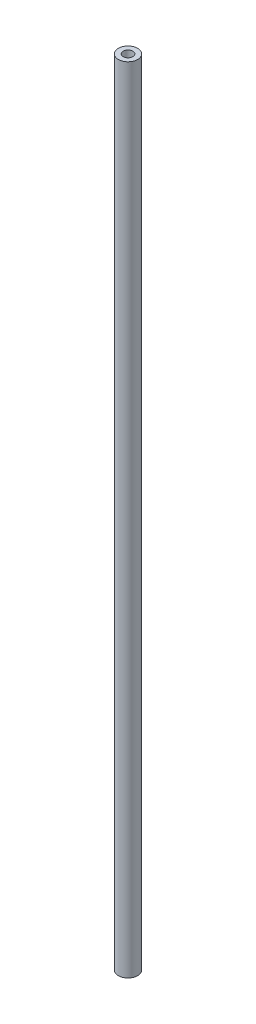
ISO-10303-21;
HEADER;
FILE_DESCRIPTION(('STEP AP214'),'2;1');
FILE_NAME('part.step','',(''),(''),'','','');
FILE_SCHEMA(('AUTOMOTIVE_DESIGN { 1 0 10303 214 1 1 1 1 }'));
ENDSEC;
DATA;
#1=APPLICATION_CONTEXT('core data for automotive mechanical design processes');
#2=APPLICATION_PROTOCOL_DEFINITION('international standard','automotive_design',2000,#1);
#3=PRODUCT_CONTEXT('',#1,'mechanical');
#4=PRODUCT('Part','Part','',(#3));
#5=PRODUCT_RELATED_PRODUCT_CATEGORY('part','',(#4));
#6=PRODUCT_DEFINITION_FORMATION('','',#4);
#7=PRODUCT_DEFINITION_CONTEXT('part definition',#1,'design');
#8=PRODUCT_DEFINITION('design','',#6,#7);
#9=PRODUCT_DEFINITION_SHAPE('','',#8);
#10=(LENGTH_UNIT() NAMED_UNIT(*) SI_UNIT(.MILLI.,.METRE.));
#11=(NAMED_UNIT(*) PLANE_ANGLE_UNIT() SI_UNIT($,.RADIAN.));
#12=(NAMED_UNIT(*) SI_UNIT($,.STERADIAN.) SOLID_ANGLE_UNIT());
#13=UNCERTAINTY_MEASURE_WITH_UNIT(LENGTH_MEASURE(1.E-05),#10,'distance_accuracy_value','');
#14=(GEOMETRIC_REPRESENTATION_CONTEXT(3) GLOBAL_UNCERTAINTY_ASSIGNED_CONTEXT((#13)) GLOBAL_UNIT_ASSIGNED_CONTEXT((#10,
#11,#12)) REPRESENTATION_CONTEXT('',''));
#15=CARTESIAN_POINT('',(0.,0.,0.));
#16=DIRECTION('',(0.,0.,1.));
#17=DIRECTION('',(1.,0.,0.));
#18=AXIS2_PLACEMENT_3D('',#15,#16,#17);
#19=CARTESIAN_POINT('',(0.,0.,0.));
#20=DIRECTION('',(0.,-1.,0.));
#21=DIRECTION('',(0.,0.,-1.));
#22=AXIS2_PLACEMENT_3D('',#19,#20,#21);
#23=CYLINDRICAL_SURFACE('',#22,1.);
#24=CARTESIAN_POINT('',(0.,164.,0.));
#25=DIRECTION('',(0.,-1.,0.));
#26=DIRECTION('',(0.,0.,-1.));
#27=AXIS2_PLACEMENT_3D('',#24,#25,#26);
#28=CIRCLE('',#27,1.);
#29=CARTESIAN_POINT('',(0.,164.,-1.));
#30=VERTEX_POINT('',#29);
#31=EDGE_CURVE('E10',#30,#30,#28,.T.);
#32=ORIENTED_EDGE('',*,*,#31,.F.);
#33=EDGE_LOOP('',(#32));
#34=FACE_BOUND('',#33,.T.);
#35=CARTESIAN_POINT('',(0.,0.,0.));
#36=DIRECTION('',(0.,-1.,0.));
#37=DIRECTION('',(0.,0.,-1.));
#38=AXIS2_PLACEMENT_3D('',#35,#36,#37);
#39=CIRCLE('',#38,1.);
#40=CARTESIAN_POINT('',(0.,0.,-1.));
#41=VERTEX_POINT('',#40);
#42=EDGE_CURVE('E44',#41,#41,#39,.T.);
#43=ORIENTED_EDGE('',*,*,#42,.T.);
#44=EDGE_LOOP('',(#43));
#45=FACE_BOUND('',#44,.T.);
#46=ADVANCED_FACE('F30',(#34,#45),#23,.F.);
#47=CARTESIAN_POINT('',(-1.,164.,0.));
#48=DIRECTION('',(0.,-1.,0.));
#49=DIRECTION('',(0.,0.,-1.));
#50=AXIS2_PLACEMENT_3D('',#47,#48,#49);
#51=PLANE('',#50);
#52=CARTESIAN_POINT('',(0.,164.,0.));
#53=DIRECTION('',(0.,-1.,0.));
#54=DIRECTION('',(0.,0.,-1.));
#55=AXIS2_PLACEMENT_3D('',#52,#53,#54);
#56=CIRCLE('',#55,2.);
#57=CARTESIAN_POINT('',(0.,164.,-2.));
#58=VERTEX_POINT('',#57);
#59=EDGE_CURVE('E36',#58,#58,#56,.T.);
#60=ORIENTED_EDGE('',*,*,#59,.F.);
#61=EDGE_LOOP('',(#60));
#62=FACE_BOUND('',#61,.T.);
#63=ORIENTED_EDGE('',*,*,#31,.T.);
#64=EDGE_LOOP('',(#63));
#65=FACE_BOUND('',#64,.T.);
#66=ADVANCED_FACE('F59',(#62,#65),#51,.F.);
#67=CARTESIAN_POINT('',(0.,0.,0.));
#68=DIRECTION('',(0.,-1.,0.));
#69=DIRECTION('',(0.,0.,-1.));
#70=AXIS2_PLACEMENT_3D('',#67,#68,#69);
#71=CYLINDRICAL_SURFACE('',#70,2.);
#72=CARTESIAN_POINT('',(0.,0.,0.));
#73=DIRECTION('',(0.,-1.,0.));
#74=DIRECTION('',(0.,0.,-1.));
#75=AXIS2_PLACEMENT_3D('',#72,#73,#74);
#76=CIRCLE('',#75,2.);
#77=CARTESIAN_POINT('',(0.,0.,-2.));
#78=VERTEX_POINT('',#77);
#79=EDGE_CURVE('E40',#78,#78,#76,.T.);
#80=ORIENTED_EDGE('',*,*,#79,.F.);
#81=EDGE_LOOP('',(#80));
#82=FACE_BOUND('',#81,.T.);
#83=ORIENTED_EDGE('',*,*,#59,.T.);
#84=EDGE_LOOP('',(#83));
#85=FACE_BOUND('',#84,.T.);
#86=ADVANCED_FACE('F54',(#82,#85),#71,.T.);
#87=CARTESIAN_POINT('',(-1.,0.,0.));
#88=DIRECTION('',(0.,1.,0.));
#89=DIRECTION('',(0.,0.,1.));
#90=AXIS2_PLACEMENT_3D('',#87,#88,#89);
#91=PLANE('',#90);
#92=ORIENTED_EDGE('',*,*,#42,.F.);
#93=EDGE_LOOP('',(#92));
#94=FACE_BOUND('',#93,.T.);
#95=ORIENTED_EDGE('',*,*,#79,.T.);
#96=EDGE_LOOP('',(#95));
#97=FACE_BOUND('',#96,.T.);
#98=ADVANCED_FACE('F51',(#94,#97),#91,.F.);
#99=CLOSED_SHELL('',(#46,#66,#86,#98));
#100=MANIFOLD_SOLID_BREP('B2',#99);
#101=ADVANCED_BREP_SHAPE_REPRESENTATION('',(#18,#100),#14);
#102=SHAPE_DEFINITION_REPRESENTATION(#9,#101);
ENDSEC;
END-ISO-10303-21;
